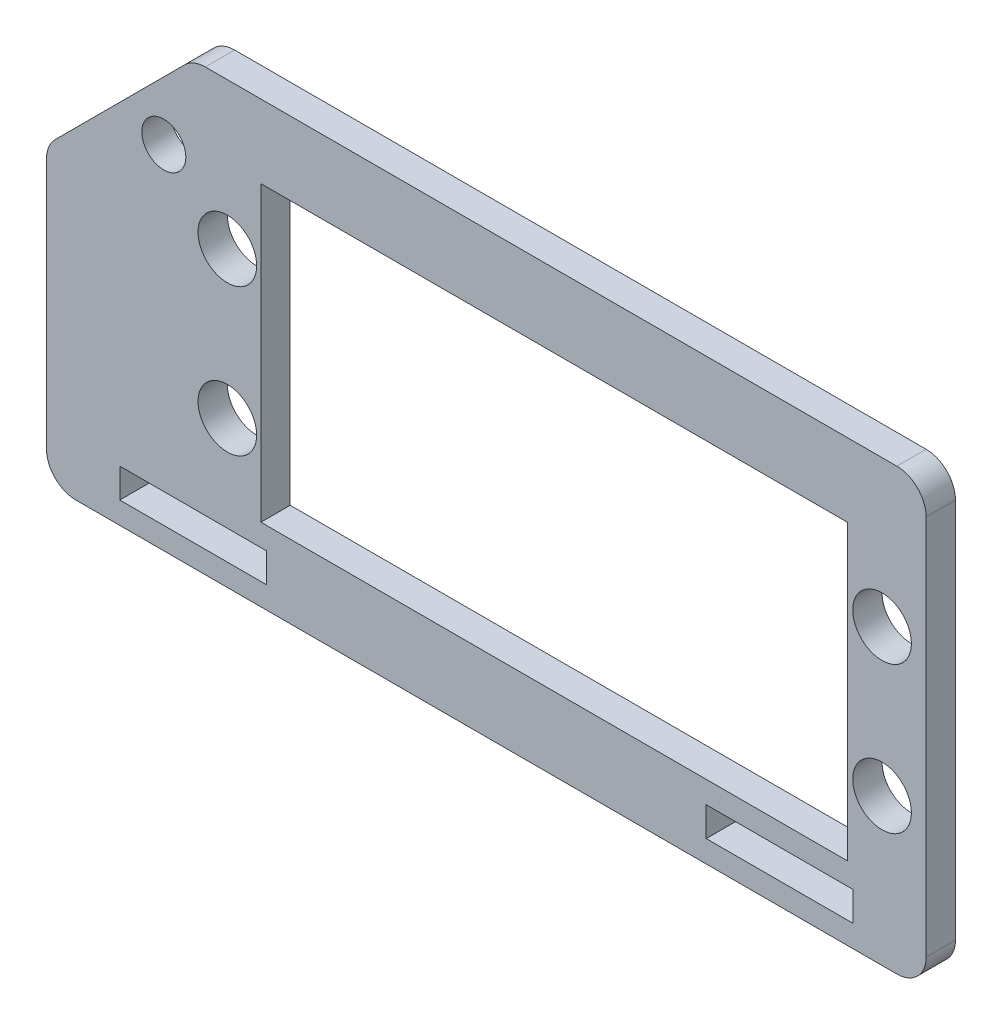
ISO-10303-21;
HEADER;
FILE_DESCRIPTION(('STEP AP214'),'2;1');
FILE_NAME('part.step','',(''),(''),'','','');
FILE_SCHEMA(('AUTOMOTIVE_DESIGN { 1 0 10303 214 1 1 1 1 }'));
ENDSEC;
DATA;
#1=APPLICATION_CONTEXT('core data for automotive mechanical design processes');
#2=APPLICATION_PROTOCOL_DEFINITION('international standard','automotive_design',2000,#1);
#3=PRODUCT_CONTEXT('',#1,'mechanical');
#4=PRODUCT('Part','Part','',(#3));
#5=PRODUCT_RELATED_PRODUCT_CATEGORY('part','',(#4));
#6=PRODUCT_DEFINITION_FORMATION('','',#4);
#7=PRODUCT_DEFINITION_CONTEXT('part definition',#1,'design');
#8=PRODUCT_DEFINITION('design','',#6,#7);
#9=PRODUCT_DEFINITION_SHAPE('','',#8);
#10=(LENGTH_UNIT() NAMED_UNIT(*) SI_UNIT(.MILLI.,.METRE.));
#11=(NAMED_UNIT(*) PLANE_ANGLE_UNIT() SI_UNIT($,.RADIAN.));
#12=(NAMED_UNIT(*) SI_UNIT($,.STERADIAN.) SOLID_ANGLE_UNIT());
#13=UNCERTAINTY_MEASURE_WITH_UNIT(LENGTH_MEASURE(1.E-05),#10,'distance_accuracy_value','');
#14=(GEOMETRIC_REPRESENTATION_CONTEXT(3) GLOBAL_UNCERTAINTY_ASSIGNED_CONTEXT((#13)) GLOBAL_UNIT_ASSIGNED_CONTEXT((#10,
#11,#12)) REPRESENTATION_CONTEXT('',''));
#15=CARTESIAN_POINT('',(0.,0.,0.));
#16=DIRECTION('',(0.,0.,1.));
#17=DIRECTION('',(1.,0.,0.));
#18=AXIS2_PLACEMENT_3D('',#15,#16,#17);
#19=CARTESIAN_POINT('',(2.251619932187,-0.110961656666,2.));
#20=DIRECTION('',(0.,0.,1.));
#21=DIRECTION('',(1.,0.,0.));
#22=AXIS2_PLACEMENT_3D('',#19,#20,#21);
#23=PLANE('',#22);
#24=CARTESIAN_POINT('',(-22.,9.,2.));
#25=DIRECTION('',(0.,0.,1.));
#26=DIRECTION('',(1.,0.,0.));
#27=AXIS2_PLACEMENT_3D('',#24,#25,#26);
#28=CIRCLE('',#27,1.5);
#29=CARTESIAN_POINT('',(-20.5,9.,2.));
#30=VERTEX_POINT('',#29);
#31=EDGE_CURVE('E386',#30,#30,#28,.T.);
#32=ORIENTED_EDGE('',*,*,#31,.F.);
#33=EDGE_LOOP('',(#32));
#34=FACE_BOUND('',#33,.T.);
#35=CARTESIAN_POINT('',(26.993404,5.015138,2.));
#36=DIRECTION('',(0.,0.,1.));
#37=DIRECTION('',(1.,0.,0.));
#38=AXIS2_PLACEMENT_3D('',#35,#36,#37);
#39=CIRCLE('',#38,2.);
#40=CARTESIAN_POINT('',(28.993404,5.015138,2.));
#41=VERTEX_POINT('',#40);
#42=EDGE_CURVE('E346',#41,#41,#39,.T.);
#43=ORIENTED_EDGE('',*,*,#42,.F.);
#44=EDGE_LOOP('',(#43));
#45=FACE_BOUND('',#44,.T.);
#46=CARTESIAN_POINT('',(26.993404,-4.984862,2.));
#47=DIRECTION('',(0.,0.,1.));
#48=DIRECTION('',(1.,0.,0.));
#49=AXIS2_PLACEMENT_3D('',#46,#47,#48);
#50=CIRCLE('',#49,2.);
#51=CARTESIAN_POINT('',(28.993404,-4.984862,2.));
#52=VERTEX_POINT('',#51);
#53=EDGE_CURVE('E343',#52,#52,#50,.T.);
#54=ORIENTED_EDGE('',*,*,#53,.F.);
#55=EDGE_LOOP('',(#54));
#56=FACE_BOUND('',#55,.T.);
#57=CARTESIAN_POINT('',(-17.667086,5.,2.));
#58=DIRECTION('',(0.,0.,1.));
#59=DIRECTION('',(1.,0.,0.));
#60=AXIS2_PLACEMENT_3D('',#57,#58,#59);
#61=CIRCLE('',#60,2.);
#62=CARTESIAN_POINT('',(-15.667086,5.,2.));
#63=VERTEX_POINT('',#62);
#64=EDGE_CURVE('E347',#63,#63,#61,.T.);
#65=ORIENTED_EDGE('',*,*,#64,.F.);
#66=EDGE_LOOP('',(#65));
#67=FACE_BOUND('',#66,.T.);
#68=CARTESIAN_POINT('',(-17.667086,-5.,2.));
#69=DIRECTION('',(0.,0.,1.));
#70=DIRECTION('',(1.,0.,0.));
#71=AXIS2_PLACEMENT_3D('',#68,#69,#70);
#72=CIRCLE('',#71,2.);
#73=CARTESIAN_POINT('',(-15.667086,-5.,2.));
#74=VERTEX_POINT('',#73);
#75=EDGE_CURVE('E351',#74,#74,#72,.T.);
#76=ORIENTED_EDGE('',*,*,#75,.F.);
#77=EDGE_LOOP('',(#76));
#78=FACE_BOUND('',#77,.T.);
#79=DIRECTION('',(-1.,0.,0.));
#80=VECTOR('',#79,1.);
#81=CARTESIAN_POINT('',(24.621888,10.,2.));
#82=LINE('',#81,#80);
#83=CARTESIAN_POINT('',(24.621888,10.,2.));
#84=VERTEX_POINT('',#83);
#85=CARTESIAN_POINT('',(-15.378112,10.,2.));
#86=VERTEX_POINT('',#85);
#87=EDGE_CURVE('E310',#84,#86,#82,.T.);
#88=ORIENTED_EDGE('',*,*,#87,.F.);
#89=DIRECTION('',(0.,1.,0.));
#90=VECTOR('',#89,1.);
#91=CARTESIAN_POINT('',(24.621888,-10.,2.));
#92=LINE('',#91,#90);
#93=CARTESIAN_POINT('',(24.621888,-10.,2.));
#94=VERTEX_POINT('',#93);
#95=EDGE_CURVE('E306',#94,#84,#92,.T.);
#96=ORIENTED_EDGE('',*,*,#95,.F.);
#97=DIRECTION('',(1.,0.,0.));
#98=VECTOR('',#97,1.);
#99=CARTESIAN_POINT('',(-15.378112,-10.,2.));
#100=LINE('',#99,#98);
#101=CARTESIAN_POINT('',(-15.378112,-10.,2.));
#102=VERTEX_POINT('',#101);
#103=EDGE_CURVE('E309',#102,#94,#100,.T.);
#104=ORIENTED_EDGE('',*,*,#103,.F.);
#105=DIRECTION('',(0.,-1.,0.));
#106=VECTOR('',#105,1.);
#107=CARTESIAN_POINT('',(-15.378112,10.,2.));
#108=LINE('',#107,#106);
#109=EDGE_CURVE('E333',#86,#102,#108,.T.);
#110=ORIENTED_EDGE('',*,*,#109,.F.);
#111=EDGE_LOOP('',(#88,#96,#104,#110));
#112=FACE_BOUND('',#111,.T.);
#113=DIRECTION('',(1.,0.,0.));
#114=VECTOR('',#113,1.);
#115=CARTESIAN_POINT('',(-20.,15.,2.));
#116=LINE('',#115,#114);
#117=CARTESIAN_POINT('',(-19.17157287525,15.,2.));
#118=VERTEX_POINT('',#117);
#119=CARTESIAN_POINT('',(28.,15.,2.));
#120=VERTEX_POINT('',#119);
#121=EDGE_CURVE('E297',#118,#120,#116,.T.);
#122=ORIENTED_EDGE('',*,*,#121,.F.);
#123=CARTESIAN_POINT('',(-19.17157287525,13.,2.));
#124=DIRECTION('',(0.,0.,1.));
#125=DIRECTION('',(0.,-1.,0.));
#126=AXIS2_PLACEMENT_3D('',#123,#124,#125);
#127=CIRCLE('',#126,2.);
#128=CARTESIAN_POINT('',(-20.58578643762,14.414213562373,2.));
#129=VERTEX_POINT('',#128);
#130=EDGE_CURVE('E408',#118,#129,#127,.T.);
#131=ORIENTED_EDGE('',*,*,#130,.T.);
#132=DIRECTION('',(-0.707106781186548,-0.707106781186548,0.));
#133=VECTOR('',#132,1.);
#134=CARTESIAN_POINT('',(-20.,15.,2.));
#135=LINE('',#134,#133);
#136=CARTESIAN_POINT('',(-29.41421356237,5.585786437627,2.));
#137=VERTEX_POINT('',#136);
#138=EDGE_CURVE('E354',#129,#137,#135,.T.);
#139=ORIENTED_EDGE('',*,*,#138,.T.);
#140=CARTESIAN_POINT('',(-28.,4.171572875254,2.));
#141=DIRECTION('',(0.,0.,-1.));
#142=DIRECTION('',(0.,-1.,0.));
#143=AXIS2_PLACEMENT_3D('',#140,#141,#142);
#144=CIRCLE('',#143,2.);
#145=CARTESIAN_POINT('',(-30.,4.171572875254,2.));
#146=VERTEX_POINT('',#145);
#147=EDGE_CURVE('E357',#146,#137,#144,.T.);
#148=ORIENTED_EDGE('',*,*,#147,.F.);
#149=DIRECTION('',(0.,-1.,0.));
#150=VECTOR('',#149,1.);
#151=CARTESIAN_POINT('',(-30.,5.,2.));
#152=LINE('',#151,#150);
#153=CARTESIAN_POINT('',(-30.,-13.,2.));
#154=VERTEX_POINT('',#153);
#155=EDGE_CURVE('E394',#146,#154,#152,.T.);
#156=ORIENTED_EDGE('',*,*,#155,.T.);
#157=CARTESIAN_POINT('',(-28.,-13.,2.));
#158=DIRECTION('',(0.,0.,-1.));
#159=DIRECTION('',(0.,-1.,0.));
#160=AXIS2_PLACEMENT_3D('',#157,#158,#159);
#161=CIRCLE('',#160,2.);
#162=CARTESIAN_POINT('',(-28.,-15.,2.));
#163=VERTEX_POINT('',#162);
#164=EDGE_CURVE('E390',#163,#154,#161,.T.);
#165=ORIENTED_EDGE('',*,*,#164,.F.);
#166=DIRECTION('',(1.,0.,0.));
#167=VECTOR('',#166,1.);
#168=CARTESIAN_POINT('',(-30.,-15.,2.));
#169=LINE('',#168,#167);
#170=CARTESIAN_POINT('',(28.,-15.,2.));
#171=VERTEX_POINT('',#170);
#172=EDGE_CURVE('E387',#163,#171,#169,.T.);
#173=ORIENTED_EDGE('',*,*,#172,.T.);
#174=CARTESIAN_POINT('',(28.,-13.,2.));
#175=DIRECTION('',(0.,0.,-1.));
#176=DIRECTION('',(0.,-1.,0.));
#177=AXIS2_PLACEMENT_3D('',#174,#175,#176);
#178=CIRCLE('',#177,2.);
#179=CARTESIAN_POINT('',(30.,-13.,2.));
#180=VERTEX_POINT('',#179);
#181=EDGE_CURVE('E323',#180,#171,#178,.T.);
#182=ORIENTED_EDGE('',*,*,#181,.F.);
#183=DIRECTION('',(0.,-1.,0.));
#184=VECTOR('',#183,1.);
#185=CARTESIAN_POINT('',(30.,15.,2.));
#186=LINE('',#185,#184);
#187=CARTESIAN_POINT('',(30.,13.,2.));
#188=VERTEX_POINT('',#187);
#189=EDGE_CURVE('E320',#188,#180,#186,.T.);
#190=ORIENTED_EDGE('',*,*,#189,.F.);
#191=CARTESIAN_POINT('',(28.,13.,2.));
#192=DIRECTION('',(0.,0.,-1.));
#193=DIRECTION('',(0.,-1.,0.));
#194=AXIS2_PLACEMENT_3D('',#191,#192,#193);
#195=CIRCLE('',#194,2.);
#196=EDGE_CURVE('E369',#120,#188,#195,.T.);
#197=ORIENTED_EDGE('',*,*,#196,.F.);
#198=EDGE_LOOP('',(#122,#131,#139,#148,#156,#165,#173,#182,#190,#197));
#199=FACE_BOUND('',#198,.T.);
#200=DIRECTION('',(1.,0.,0.));
#201=VECTOR('',#200,1.);
#202=CARTESIAN_POINT('',(2.251619932187,-11.5,2.));
#203=LINE('',#202,#201);
#204=CARTESIAN_POINT('',(15.,-11.5,2.));
#205=VERTEX_POINT('',#204);
#206=CARTESIAN_POINT('',(25.,-11.5,2.));
#207=VERTEX_POINT('',#206);
#208=EDGE_CURVE('E255',#205,#207,#203,.T.);
#209=ORIENTED_EDGE('',*,*,#208,.T.);
#210=DIRECTION('',(0.,-1.,0.));
#211=VECTOR('',#210,1.);
#212=CARTESIAN_POINT('',(25.,-0.110961656666,2.));
#213=LINE('',#212,#211);
#214=CARTESIAN_POINT('',(25.,-13.5,2.));
#215=VERTEX_POINT('',#214);
#216=EDGE_CURVE('E282',#207,#215,#213,.T.);
#217=ORIENTED_EDGE('',*,*,#216,.T.);
#218=DIRECTION('',(1.,0.,0.));
#219=VECTOR('',#218,1.);
#220=CARTESIAN_POINT('',(2.251619932187,-13.5,2.));
#221=LINE('',#220,#219);
#222=CARTESIAN_POINT('',(15.,-13.5,2.));
#223=VERTEX_POINT('',#222);
#224=EDGE_CURVE('E280',#223,#215,#221,.T.);
#225=ORIENTED_EDGE('',*,*,#224,.F.);
#226=DIRECTION('',(0.,-1.,0.));
#227=VECTOR('',#226,1.);
#228=CARTESIAN_POINT('',(15.,-0.110961656666,2.));
#229=LINE('',#228,#227);
#230=EDGE_CURVE('E278',#205,#223,#229,.T.);
#231=ORIENTED_EDGE('',*,*,#230,.F.);
#232=EDGE_LOOP('',(#209,#217,#225,#231));
#233=FACE_BOUND('',#232,.T.);
#234=DIRECTION('',(1.,0.,0.));
#235=VECTOR('',#234,1.);
#236=CARTESIAN_POINT('',(2.251619932187,-11.5,2.));
#237=LINE('',#236,#235);
#238=CARTESIAN_POINT('',(-25.,-11.5,2.));
#239=VERTEX_POINT('',#238);
#240=CARTESIAN_POINT('',(-15.,-11.5,2.));
#241=VERTEX_POINT('',#240);
#242=EDGE_CURVE('E285',#239,#241,#237,.T.);
#243=ORIENTED_EDGE('',*,*,#242,.T.);
#244=DIRECTION('',(0.,-1.,0.));
#245=VECTOR('',#244,1.);
#246=CARTESIAN_POINT('',(-15.,-0.110961656666,2.));
#247=LINE('',#246,#245);
#248=CARTESIAN_POINT('',(-15.,-13.5,2.));
#249=VERTEX_POINT('',#248);
#250=EDGE_CURVE('E238',#241,#249,#247,.T.);
#251=ORIENTED_EDGE('',*,*,#250,.T.);
#252=DIRECTION('',(1.,0.,0.));
#253=VECTOR('',#252,1.);
#254=CARTESIAN_POINT('',(2.251619932187,-13.5,2.));
#255=LINE('',#254,#253);
#256=CARTESIAN_POINT('',(-25.,-13.5,2.));
#257=VERTEX_POINT('',#256);
#258=EDGE_CURVE('E289',#257,#249,#255,.T.);
#259=ORIENTED_EDGE('',*,*,#258,.F.);
#260=DIRECTION('',(0.,-1.,0.));
#261=VECTOR('',#260,1.);
#262=CARTESIAN_POINT('',(-25.,-0.110961656666,2.));
#263=LINE('',#262,#261);
#264=EDGE_CURVE('E287',#239,#257,#263,.T.);
#265=ORIENTED_EDGE('',*,*,#264,.F.);
#266=EDGE_LOOP('',(#243,#251,#259,#265));
#267=FACE_BOUND('',#266,.T.);
#268=ADVANCED_FACE('F44',(#34,#45,#56,#67,#78,#112,#199,#233,#267),#23,.T.);
#269=CARTESIAN_POINT('',(2.251619932187,-0.110961656666,0.));
#270=DIRECTION('',(0.,0.,1.));
#271=DIRECTION('',(1.,0.,0.));
#272=AXIS2_PLACEMENT_3D('',#269,#270,#271);
#273=PLANE('',#272);
#274=DIRECTION('',(0.,-1.,0.));
#275=VECTOR('',#274,1.);
#276=CARTESIAN_POINT('',(25.,0.,0.));
#277=LINE('',#276,#275);
#278=CARTESIAN_POINT('',(25.,-11.5,0.));
#279=VERTEX_POINT('',#278);
#280=CARTESIAN_POINT('',(25.,-13.5,0.));
#281=VERTEX_POINT('',#280);
#282=EDGE_CURVE('E260',#279,#281,#277,.T.);
#283=ORIENTED_EDGE('',*,*,#282,.F.);
#284=DIRECTION('',(1.,0.,0.));
#285=VECTOR('',#284,1.);
#286=CARTESIAN_POINT('',(0.,-11.5,0.));
#287=LINE('',#286,#285);
#288=CARTESIAN_POINT('',(15.,-11.5,0.));
#289=VERTEX_POINT('',#288);
#290=EDGE_CURVE('E262',#289,#279,#287,.T.);
#291=ORIENTED_EDGE('',*,*,#290,.F.);
#292=DIRECTION('',(0.,-1.,0.));
#293=VECTOR('',#292,1.);
#294=CARTESIAN_POINT('',(15.,0.,0.));
#295=LINE('',#294,#293);
#296=CARTESIAN_POINT('',(15.,-13.5,0.));
#297=VERTEX_POINT('',#296);
#298=EDGE_CURVE('E264',#289,#297,#295,.T.);
#299=ORIENTED_EDGE('',*,*,#298,.T.);
#300=DIRECTION('',(1.,0.,0.));
#301=VECTOR('',#300,1.);
#302=CARTESIAN_POINT('',(0.,-13.5,0.));
#303=LINE('',#302,#301);
#304=EDGE_CURVE('E267',#297,#281,#303,.T.);
#305=ORIENTED_EDGE('',*,*,#304,.T.);
#306=EDGE_LOOP('',(#283,#291,#299,#305));
#307=FACE_BOUND('',#306,.T.);
#308=CARTESIAN_POINT('',(-22.,9.,0.));
#309=DIRECTION('',(0.,0.,1.));
#310=DIRECTION('',(1.,0.,0.));
#311=AXIS2_PLACEMENT_3D('',#308,#309,#310);
#312=CIRCLE('',#311,1.5);
#313=CARTESIAN_POINT('',(-20.5,9.,0.));
#314=VERTEX_POINT('',#313);
#315=EDGE_CURVE('E402',#314,#314,#312,.T.);
#316=ORIENTED_EDGE('',*,*,#315,.T.);
#317=EDGE_LOOP('',(#316));
#318=FACE_BOUND('',#317,.T.);
#319=CARTESIAN_POINT('',(26.993404,5.015138,0.));
#320=DIRECTION('',(0.,0.,1.));
#321=DIRECTION('',(1.,0.,0.));
#322=AXIS2_PLACEMENT_3D('',#319,#320,#321);
#323=CIRCLE('',#322,2.);
#324=CARTESIAN_POINT('',(28.993404,5.015138,0.));
#325=VERTEX_POINT('',#324);
#326=EDGE_CURVE('E376',#325,#325,#323,.T.);
#327=ORIENTED_EDGE('',*,*,#326,.T.);
#328=EDGE_LOOP('',(#327));
#329=FACE_BOUND('',#328,.T.);
#330=CARTESIAN_POINT('',(26.993404,-4.984862,0.));
#331=DIRECTION('',(0.,0.,1.));
#332=DIRECTION('',(1.,0.,0.));
#333=AXIS2_PLACEMENT_3D('',#330,#331,#332);
#334=CIRCLE('',#333,2.);
#335=CARTESIAN_POINT('',(28.993404,-4.984862,0.));
#336=VERTEX_POINT('',#335);
#337=EDGE_CURVE('E373',#336,#336,#334,.T.);
#338=ORIENTED_EDGE('',*,*,#337,.T.);
#339=EDGE_LOOP('',(#338));
#340=FACE_BOUND('',#339,.T.);
#341=CARTESIAN_POINT('',(-17.667086,5.,0.));
#342=DIRECTION('',(0.,0.,1.));
#343=DIRECTION('',(1.,0.,0.));
#344=AXIS2_PLACEMENT_3D('',#341,#342,#343);
#345=CIRCLE('',#344,2.);
#346=CARTESIAN_POINT('',(-15.667086,5.,0.));
#347=VERTEX_POINT('',#346);
#348=EDGE_CURVE('E48',#347,#347,#345,.T.);
#349=ORIENTED_EDGE('',*,*,#348,.T.);
#350=EDGE_LOOP('',(#349));
#351=FACE_BOUND('',#350,.T.);
#352=CARTESIAN_POINT('',(-17.667086,-5.,0.));
#353=DIRECTION('',(0.,0.,1.));
#354=DIRECTION('',(1.,0.,0.));
#355=AXIS2_PLACEMENT_3D('',#352,#353,#354);
#356=CIRCLE('',#355,2.);
#357=CARTESIAN_POINT('',(-15.667086,-5.,0.));
#358=VERTEX_POINT('',#357);
#359=EDGE_CURVE('E314',#358,#358,#356,.T.);
#360=ORIENTED_EDGE('',*,*,#359,.T.);
#361=EDGE_LOOP('',(#360));
#362=FACE_BOUND('',#361,.T.);
#363=DIRECTION('',(0.,-1.,0.));
#364=VECTOR('',#363,1.);
#365=CARTESIAN_POINT('',(-15.378112,10.,0.));
#366=LINE('',#365,#364);
#367=CARTESIAN_POINT('',(-15.378112,10.,0.));
#368=VERTEX_POINT('',#367);
#369=CARTESIAN_POINT('',(-15.378112,-10.,0.));
#370=VERTEX_POINT('',#369);
#371=EDGE_CURVE('E337',#368,#370,#366,.T.);
#372=ORIENTED_EDGE('',*,*,#371,.T.);
#373=DIRECTION('',(1.,0.,0.));
#374=VECTOR('',#373,1.);
#375=CARTESIAN_POINT('',(-15.378112,-10.,0.));
#376=LINE('',#375,#374);
#377=CARTESIAN_POINT('',(24.621888,-10.,0.));
#378=VERTEX_POINT('',#377);
#379=EDGE_CURVE('E334',#370,#378,#376,.T.);
#380=ORIENTED_EDGE('',*,*,#379,.T.);
#381=DIRECTION('',(0.,1.,0.));
#382=VECTOR('',#381,1.);
#383=CARTESIAN_POINT('',(24.621888,-10.,0.));
#384=LINE('',#383,#382);
#385=CARTESIAN_POINT('',(24.621888,10.,0.));
#386=VERTEX_POINT('',#385);
#387=EDGE_CURVE('E315',#378,#386,#384,.T.);
#388=ORIENTED_EDGE('',*,*,#387,.T.);
#389=DIRECTION('',(-1.,0.,0.));
#390=VECTOR('',#389,1.);
#391=CARTESIAN_POINT('',(24.621888,10.,0.));
#392=LINE('',#391,#390);
#393=EDGE_CURVE('E311',#386,#368,#392,.T.);
#394=ORIENTED_EDGE('',*,*,#393,.T.);
#395=EDGE_LOOP('',(#372,#380,#388,#394));
#396=FACE_BOUND('',#395,.T.);
#397=CARTESIAN_POINT('',(28.,13.,0.));
#398=DIRECTION('',(0.,0.,-1.));
#399=DIRECTION('',(0.,-1.,0.));
#400=AXIS2_PLACEMENT_3D('',#397,#398,#399);
#401=CIRCLE('',#400,2.);
#402=CARTESIAN_POINT('',(28.,15.,0.));
#403=VERTEX_POINT('',#402);
#404=CARTESIAN_POINT('',(30.,13.,0.));
#405=VERTEX_POINT('',#404);
#406=EDGE_CURVE('E296',#403,#405,#401,.T.);
#407=ORIENTED_EDGE('',*,*,#406,.T.);
#408=DIRECTION('',(0.,-1.,0.));
#409=VECTOR('',#408,1.);
#410=CARTESIAN_POINT('',(30.,15.,0.));
#411=LINE('',#410,#409);
#412=CARTESIAN_POINT('',(30.,-13.,0.));
#413=VERTEX_POINT('',#412);
#414=EDGE_CURVE('E324',#405,#413,#411,.T.);
#415=ORIENTED_EDGE('',*,*,#414,.T.);
#416=CARTESIAN_POINT('',(28.,-13.,0.));
#417=DIRECTION('',(0.,0.,-1.));
#418=DIRECTION('',(0.,-1.,0.));
#419=AXIS2_PLACEMENT_3D('',#416,#417,#418);
#420=CIRCLE('',#419,2.);
#421=CARTESIAN_POINT('',(28.,-15.,0.));
#422=VERTEX_POINT('',#421);
#423=EDGE_CURVE('E327',#413,#422,#420,.T.);
#424=ORIENTED_EDGE('',*,*,#423,.T.);
#425=DIRECTION('',(1.,0.,0.));
#426=VECTOR('',#425,1.);
#427=CARTESIAN_POINT('',(-30.,-15.,0.));
#428=LINE('',#427,#426);
#429=CARTESIAN_POINT('',(-28.,-15.,0.));
#430=VERTEX_POINT('',#429);
#431=EDGE_CURVE('E362',#430,#422,#428,.T.);
#432=ORIENTED_EDGE('',*,*,#431,.F.);
#433=CARTESIAN_POINT('',(-28.,-13.,0.));
#434=DIRECTION('',(0.,0.,-1.));
#435=DIRECTION('',(0.,-1.,0.));
#436=AXIS2_PLACEMENT_3D('',#433,#434,#435);
#437=CIRCLE('',#436,2.);
#438=CARTESIAN_POINT('',(-30.,-13.,0.));
#439=VERTEX_POINT('',#438);
#440=EDGE_CURVE('E359',#430,#439,#437,.T.);
#441=ORIENTED_EDGE('',*,*,#440,.T.);
#442=DIRECTION('',(0.,-1.,0.));
#443=VECTOR('',#442,1.);
#444=CARTESIAN_POINT('',(-30.,5.,0.));
#445=LINE('',#444,#443);
#446=CARTESIAN_POINT('',(-30.,4.171572875254,0.));
#447=VERTEX_POINT('',#446);
#448=EDGE_CURVE('E350',#447,#439,#445,.T.);
#449=ORIENTED_EDGE('',*,*,#448,.F.);
#450=CARTESIAN_POINT('',(-28.,4.171572875254,0.));
#451=DIRECTION('',(0.,0.,-1.));
#452=DIRECTION('',(0.,-1.,0.));
#453=AXIS2_PLACEMENT_3D('',#450,#451,#452);
#454=CIRCLE('',#453,2.);
#455=CARTESIAN_POINT('',(-29.41421356237,5.585786437627,0.));
#456=VERTEX_POINT('',#455);
#457=EDGE_CURVE('E342',#447,#456,#454,.T.);
#458=ORIENTED_EDGE('',*,*,#457,.T.);
#459=DIRECTION('',(-0.707106781186548,-0.707106781186548,0.));
#460=VECTOR('',#459,1.);
#461=CARTESIAN_POINT('',(-20.,15.,0.));
#462=LINE('',#461,#460);
#463=CARTESIAN_POINT('',(-20.58578643762,14.414213562373,0.));
#464=VERTEX_POINT('',#463);
#465=EDGE_CURVE('E338',#464,#456,#462,.T.);
#466=ORIENTED_EDGE('',*,*,#465,.F.);
#467=CARTESIAN_POINT('',(-19.17157287525,13.,0.));
#468=DIRECTION('',(0.,0.,1.));
#469=DIRECTION('',(0.,-1.,0.));
#470=AXIS2_PLACEMENT_3D('',#467,#468,#469);
#471=CIRCLE('',#470,2.);
#472=CARTESIAN_POINT('',(-19.17157287525,15.,0.));
#473=VERTEX_POINT('',#472);
#474=EDGE_CURVE('E341',#473,#464,#471,.T.);
#475=ORIENTED_EDGE('',*,*,#474,.F.);
#476=DIRECTION('',(1.,0.,0.));
#477=VECTOR('',#476,1.);
#478=CARTESIAN_POINT('',(-20.,15.,0.));
#479=LINE('',#478,#477);
#480=EDGE_CURVE('E292',#473,#403,#479,.T.);
#481=ORIENTED_EDGE('',*,*,#480,.T.);
#482=EDGE_LOOP('',(#407,#415,#424,#432,#441,#449,#458,#466,#475,#481));
#483=FACE_BOUND('',#482,.T.);
#484=DIRECTION('',(0.,-1.,0.));
#485=VECTOR('',#484,1.);
#486=CARTESIAN_POINT('',(-15.,0.,0.));
#487=LINE('',#486,#485);
#488=CARTESIAN_POINT('',(-15.,-11.5,0.));
#489=VERTEX_POINT('',#488);
#490=CARTESIAN_POINT('',(-15.,-13.5,0.));
#491=VERTEX_POINT('',#490);
#492=EDGE_CURVE('E231',#489,#491,#487,.T.);
#493=ORIENTED_EDGE('',*,*,#492,.F.);
#494=DIRECTION('',(1.,0.,0.));
#495=VECTOR('',#494,1.);
#496=CARTESIAN_POINT('',(0.,-11.5,0.));
#497=LINE('',#496,#495);
#498=CARTESIAN_POINT('',(-25.,-11.5,0.));
#499=VERTEX_POINT('',#498);
#500=EDGE_CURVE('E223',#499,#489,#497,.T.);
#501=ORIENTED_EDGE('',*,*,#500,.F.);
#502=DIRECTION('',(0.,-1.,0.));
#503=VECTOR('',#502,1.);
#504=CARTESIAN_POINT('',(-25.,0.,0.));
#505=LINE('',#504,#503);
#506=CARTESIAN_POINT('',(-25.,-13.5,0.));
#507=VERTEX_POINT('',#506);
#508=EDGE_CURVE('E230',#499,#507,#505,.T.);
#509=ORIENTED_EDGE('',*,*,#508,.T.);
#510=DIRECTION('',(1.,0.,0.));
#511=VECTOR('',#510,1.);
#512=CARTESIAN_POINT('',(0.,-13.5,0.));
#513=LINE('',#512,#511);
#514=EDGE_CURVE('E240',#507,#491,#513,.T.);
#515=ORIENTED_EDGE('',*,*,#514,.T.);
#516=EDGE_LOOP('',(#493,#501,#509,#515));
#517=FACE_BOUND('',#516,.T.);
#518=ADVANCED_FACE('F243',(#307,#318,#329,#340,#351,#362,#396,#483,#517),#273,.F.);
#519=CARTESIAN_POINT('',(-22.,9.,0.));
#520=DIRECTION('',(0.,0.,-1.));
#521=DIRECTION('',(1.,0.,0.));
#522=AXIS2_PLACEMENT_3D('',#519,#520,#521);
#523=CYLINDRICAL_SURFACE('',#522,1.5);
#524=DIRECTION('',(0.,0.,1.));
#525=VECTOR('',#524,1.);
#526=CARTESIAN_POINT('',(-20.5,9.,0.));
#527=LINE('',#526,#525);
#528=EDGE_CURVE('E11',#314,#30,#527,.T.);
#529=ORIENTED_EDGE('',*,*,#528,.T.);
#530=ORIENTED_EDGE('',*,*,#31,.T.);
#531=ORIENTED_EDGE('',*,*,#528,.F.);
#532=ORIENTED_EDGE('',*,*,#315,.F.);
#533=EDGE_LOOP('',(#529,#530,#531,#532));
#534=FACE_BOUND('',#533,.T.);
#535=ADVANCED_FACE('F496',(#534),#523,.F.);
#536=CARTESIAN_POINT('',(26.993404,5.015138,0.));
#537=DIRECTION('',(0.,0.,-1.));
#538=DIRECTION('',(1.,0.,0.));
#539=AXIS2_PLACEMENT_3D('',#536,#537,#538);
#540=CYLINDRICAL_SURFACE('',#539,2.);
#541=DIRECTION('',(0.,0.,1.));
#542=VECTOR('',#541,1.);
#543=CARTESIAN_POINT('',(28.993404,5.015138,0.));
#544=LINE('',#543,#542);
#545=EDGE_CURVE('E53',#325,#41,#544,.T.);
#546=ORIENTED_EDGE('',*,*,#545,.T.);
#547=ORIENTED_EDGE('',*,*,#42,.T.);
#548=ORIENTED_EDGE('',*,*,#545,.F.);
#549=ORIENTED_EDGE('',*,*,#326,.F.);
#550=EDGE_LOOP('',(#546,#547,#548,#549));
#551=FACE_BOUND('',#550,.T.);
#552=ADVANCED_FACE('F46',(#551),#540,.F.);
#553=CARTESIAN_POINT('',(26.993404,-4.984862,0.));
#554=DIRECTION('',(0.,0.,-1.));
#555=DIRECTION('',(1.,0.,0.));
#556=AXIS2_PLACEMENT_3D('',#553,#554,#555);
#557=CYLINDRICAL_SURFACE('',#556,2.);
#558=DIRECTION('',(0.,0.,1.));
#559=VECTOR('',#558,1.);
#560=CARTESIAN_POINT('',(28.993404,-4.984862,0.));
#561=LINE('',#560,#559);
#562=EDGE_CURVE('E319',#336,#52,#561,.T.);
#563=ORIENTED_EDGE('',*,*,#562,.T.);
#564=ORIENTED_EDGE('',*,*,#53,.T.);
#565=ORIENTED_EDGE('',*,*,#562,.F.);
#566=ORIENTED_EDGE('',*,*,#337,.F.);
#567=EDGE_LOOP('',(#563,#564,#565,#566));
#568=FACE_BOUND('',#567,.T.);
#569=ADVANCED_FACE('F534',(#568),#557,.F.);
#570=CARTESIAN_POINT('',(-17.667086,5.,0.));
#571=DIRECTION('',(0.,0.,-1.));
#572=DIRECTION('',(1.,0.,0.));
#573=AXIS2_PLACEMENT_3D('',#570,#571,#572);
#574=CYLINDRICAL_SURFACE('',#573,2.);
#575=DIRECTION('',(0.,0.,1.));
#576=VECTOR('',#575,1.);
#577=CARTESIAN_POINT('',(-15.667086,5.,0.));
#578=LINE('',#577,#576);
#579=EDGE_CURVE('E383',#347,#63,#578,.T.);
#580=ORIENTED_EDGE('',*,*,#579,.T.);
#581=ORIENTED_EDGE('',*,*,#64,.T.);
#582=ORIENTED_EDGE('',*,*,#579,.F.);
#583=ORIENTED_EDGE('',*,*,#348,.F.);
#584=EDGE_LOOP('',(#580,#581,#582,#583));
#585=FACE_BOUND('',#584,.T.);
#586=ADVANCED_FACE('F532',(#585),#574,.F.);
#587=CARTESIAN_POINT('',(-17.667086,-5.,0.));
#588=DIRECTION('',(0.,0.,-1.));
#589=DIRECTION('',(1.,0.,0.));
#590=AXIS2_PLACEMENT_3D('',#587,#588,#589);
#591=CYLINDRICAL_SURFACE('',#590,2.);
#592=DIRECTION('',(0.,0.,1.));
#593=VECTOR('',#592,1.);
#594=CARTESIAN_POINT('',(-15.667086,-5.,0.));
#595=LINE('',#594,#593);
#596=EDGE_CURVE('E304',#358,#74,#595,.T.);
#597=ORIENTED_EDGE('',*,*,#596,.T.);
#598=ORIENTED_EDGE('',*,*,#75,.T.);
#599=ORIENTED_EDGE('',*,*,#596,.F.);
#600=ORIENTED_EDGE('',*,*,#359,.F.);
#601=EDGE_LOOP('',(#597,#598,#599,#600));
#602=FACE_BOUND('',#601,.T.);
#603=ADVANCED_FACE('F503',(#602),#591,.F.);
#604=CARTESIAN_POINT('',(24.621888,10.,0.));
#605=DIRECTION('',(0.,-1.,0.));
#606=DIRECTION('',(0.,0.,-1.));
#607=AXIS2_PLACEMENT_3D('',#604,#605,#606);
#608=PLANE('',#607);
#609=DIRECTION('',(0.,0.,1.));
#610=VECTOR('',#609,1.);
#611=CARTESIAN_POINT('',(24.621888,10.,0.));
#612=LINE('',#611,#610);
#613=EDGE_CURVE('E302',#386,#84,#612,.T.);
#614=ORIENTED_EDGE('',*,*,#613,.T.);
#615=ORIENTED_EDGE('',*,*,#87,.T.);
#616=DIRECTION('',(0.,0.,1.));
#617=VECTOR('',#616,1.);
#618=CARTESIAN_POINT('',(-15.378112,10.,0.));
#619=LINE('',#618,#617);
#620=EDGE_CURVE('E300',#368,#86,#619,.T.);
#621=ORIENTED_EDGE('',*,*,#620,.F.);
#622=ORIENTED_EDGE('',*,*,#393,.F.);
#623=EDGE_LOOP('',(#614,#615,#621,#622));
#624=FACE_BOUND('',#623,.T.);
#625=ADVANCED_FACE('F516',(#624),#608,.T.);
#626=CARTESIAN_POINT('',(24.621888,-10.,0.));
#627=DIRECTION('',(-1.,0.,0.));
#628=DIRECTION('',(0.,0.,1.));
#629=AXIS2_PLACEMENT_3D('',#626,#627,#628);
#630=PLANE('',#629);
#631=DIRECTION('',(0.,0.,1.));
#632=VECTOR('',#631,1.);
#633=CARTESIAN_POINT('',(24.621888,-10.,0.));
#634=LINE('',#633,#632);
#635=EDGE_CURVE('E305',#378,#94,#634,.T.);
#636=ORIENTED_EDGE('',*,*,#635,.T.);
#637=ORIENTED_EDGE('',*,*,#95,.T.);
#638=ORIENTED_EDGE('',*,*,#613,.F.);
#639=ORIENTED_EDGE('',*,*,#387,.F.);
#640=EDGE_LOOP('',(#636,#637,#638,#639));
#641=FACE_BOUND('',#640,.T.);
#642=ADVANCED_FACE('F513',(#641),#630,.T.);
#643=CARTESIAN_POINT('',(-15.378112,-10.,0.));
#644=DIRECTION('',(0.,1.,0.));
#645=DIRECTION('',(1.,0.,0.));
#646=AXIS2_PLACEMENT_3D('',#643,#644,#645);
#647=PLANE('',#646);
#648=DIRECTION('',(0.,0.,1.));
#649=VECTOR('',#648,1.);
#650=CARTESIAN_POINT('',(-15.378112,-10.,0.));
#651=LINE('',#650,#649);
#652=EDGE_CURVE('E380',#370,#102,#651,.T.);
#653=ORIENTED_EDGE('',*,*,#652,.T.);
#654=ORIENTED_EDGE('',*,*,#103,.T.);
#655=ORIENTED_EDGE('',*,*,#635,.F.);
#656=ORIENTED_EDGE('',*,*,#379,.F.);
#657=EDGE_LOOP('',(#653,#654,#655,#656));
#658=FACE_BOUND('',#657,.T.);
#659=ADVANCED_FACE('F509',(#658),#647,.T.);
#660=CARTESIAN_POINT('',(-15.378112,10.,0.));
#661=DIRECTION('',(1.,0.,0.));
#662=DIRECTION('',(0.,1.,0.));
#663=AXIS2_PLACEMENT_3D('',#660,#661,#662);
#664=PLANE('',#663);
#665=ORIENTED_EDGE('',*,*,#620,.T.);
#666=ORIENTED_EDGE('',*,*,#109,.T.);
#667=ORIENTED_EDGE('',*,*,#652,.F.);
#668=ORIENTED_EDGE('',*,*,#371,.F.);
#669=EDGE_LOOP('',(#665,#666,#667,#668));
#670=FACE_BOUND('',#669,.T.);
#671=ADVANCED_FACE('F512',(#670),#664,.T.);
#672=CARTESIAN_POINT('',(-28.,-13.,0.));
#673=DIRECTION('',(0.,0.,1.));
#674=DIRECTION('',(0.,-1.,0.));
#675=AXIS2_PLACEMENT_3D('',#672,#673,#674);
#676=CYLINDRICAL_SURFACE('',#675,2.);
#677=DIRECTION('',(0.,0.,1.));
#678=VECTOR('',#677,1.);
#679=CARTESIAN_POINT('',(-28.,-15.,0.));
#680=LINE('',#679,#678);
#681=EDGE_CURVE('E298',#430,#163,#680,.T.);
#682=ORIENTED_EDGE('',*,*,#681,.T.);
#683=ORIENTED_EDGE('',*,*,#164,.T.);
#684=DIRECTION('',(0.,0.,1.));
#685=VECTOR('',#684,1.);
#686=CARTESIAN_POINT('',(-30.,-13.,0.));
#687=LINE('',#686,#685);
#688=EDGE_CURVE('E301',#439,#154,#687,.T.);
#689=ORIENTED_EDGE('',*,*,#688,.F.);
#690=ORIENTED_EDGE('',*,*,#440,.F.);
#691=EDGE_LOOP('',(#682,#683,#689,#690));
#692=FACE_BOUND('',#691,.T.);
#693=ADVANCED_FACE('F461',(#692),#676,.T.);
#694=CARTESIAN_POINT('',(-30.,-15.,0.));
#695=DIRECTION('',(0.,1.,0.));
#696=DIRECTION('',(1.,0.,0.));
#697=AXIS2_PLACEMENT_3D('',#694,#695,#696);
#698=PLANE('',#697);
#699=DIRECTION('',(0.,0.,1.));
#700=VECTOR('',#699,1.);
#701=CARTESIAN_POINT('',(28.,-15.,0.));
#702=LINE('',#701,#700);
#703=EDGE_CURVE('E328',#422,#171,#702,.T.);
#704=ORIENTED_EDGE('',*,*,#703,.T.);
#705=ORIENTED_EDGE('',*,*,#172,.F.);
#706=ORIENTED_EDGE('',*,*,#681,.F.);
#707=ORIENTED_EDGE('',*,*,#431,.T.);
#708=EDGE_LOOP('',(#704,#705,#706,#707));
#709=FACE_BOUND('',#708,.T.);
#710=ADVANCED_FACE('F463',(#709),#698,.F.);
#711=CARTESIAN_POINT('',(-30.,5.,0.));
#712=DIRECTION('',(1.,0.,0.));
#713=DIRECTION('',(0.,1.,0.));
#714=AXIS2_PLACEMENT_3D('',#711,#712,#713);
#715=PLANE('',#714);
#716=ORIENTED_EDGE('',*,*,#688,.T.);
#717=ORIENTED_EDGE('',*,*,#155,.F.);
#718=DIRECTION('',(0.,0.,1.));
#719=VECTOR('',#718,1.);
#720=CARTESIAN_POINT('',(-30.,4.171572875254,0.));
#721=LINE('',#720,#719);
#722=EDGE_CURVE('E330',#447,#146,#721,.T.);
#723=ORIENTED_EDGE('',*,*,#722,.F.);
#724=ORIENTED_EDGE('',*,*,#448,.T.);
#725=EDGE_LOOP('',(#716,#717,#723,#724));
#726=FACE_BOUND('',#725,.T.);
#727=ADVANCED_FACE('F456',(#726),#715,.F.);
#728=CARTESIAN_POINT('',(28.,-13.,0.));
#729=DIRECTION('',(0.,0.,1.));
#730=DIRECTION('',(1.,0.,0.));
#731=AXIS2_PLACEMENT_3D('',#728,#729,#730);
#732=CYLINDRICAL_SURFACE('',#731,2.);
#733=DIRECTION('',(0.,0.,1.));
#734=VECTOR('',#733,1.);
#735=CARTESIAN_POINT('',(30.,-13.,0.));
#736=LINE('',#735,#734);
#737=EDGE_CURVE('E413',#413,#180,#736,.T.);
#738=ORIENTED_EDGE('',*,*,#737,.T.);
#739=ORIENTED_EDGE('',*,*,#181,.T.);
#740=ORIENTED_EDGE('',*,*,#703,.F.);
#741=ORIENTED_EDGE('',*,*,#423,.F.);
#742=EDGE_LOOP('',(#738,#739,#740,#741));
#743=FACE_BOUND('',#742,.T.);
#744=ADVANCED_FACE('F466',(#743),#732,.T.);
#745=CARTESIAN_POINT('',(-28.,4.171572875254,0.));
#746=DIRECTION('',(0.,0.,1.));
#747=DIRECTION('',(-1.,0.,0.));
#748=AXIS2_PLACEMENT_3D('',#745,#746,#747);
#749=CYLINDRICAL_SURFACE('',#748,2.);
#750=ORIENTED_EDGE('',*,*,#722,.T.);
#751=ORIENTED_EDGE('',*,*,#147,.T.);
#752=DIRECTION('',(0.,0.,1.));
#753=VECTOR('',#752,1.);
#754=CARTESIAN_POINT('',(-29.41421356237,5.585786437627,0.));
#755=LINE('',#754,#753);
#756=EDGE_CURVE('E393',#456,#137,#755,.T.);
#757=ORIENTED_EDGE('',*,*,#756,.F.);
#758=ORIENTED_EDGE('',*,*,#457,.F.);
#759=EDGE_LOOP('',(#750,#751,#757,#758));
#760=FACE_BOUND('',#759,.T.);
#761=ADVANCED_FACE('F442',(#760),#749,.T.);
#762=CARTESIAN_POINT('',(30.,15.,0.));
#763=DIRECTION('',(1.,0.,0.));
#764=DIRECTION('',(0.,1.,0.));
#765=AXIS2_PLACEMENT_3D('',#762,#763,#764);
#766=PLANE('',#765);
#767=ORIENTED_EDGE('',*,*,#414,.F.);
#768=DIRECTION('',(0.,0.,1.));
#769=VECTOR('',#768,1.);
#770=CARTESIAN_POINT('',(30.,13.,0.));
#771=LINE('',#770,#769);
#772=EDGE_CURVE('E358',#405,#188,#771,.T.);
#773=ORIENTED_EDGE('',*,*,#772,.T.);
#774=ORIENTED_EDGE('',*,*,#189,.T.);
#775=ORIENTED_EDGE('',*,*,#737,.F.);
#776=EDGE_LOOP('',(#767,#773,#774,#775));
#777=FACE_BOUND('',#776,.T.);
#778=ADVANCED_FACE('F469',(#777),#766,.T.);
#779=CARTESIAN_POINT('',(-20.,15.,0.));
#780=DIRECTION('',(0.707106781186548,-0.707106781186548,0.));
#781=DIRECTION('',(0.,0.,-1.));
#782=AXIS2_PLACEMENT_3D('',#779,#780,#781);
#783=PLANE('',#782);
#784=ORIENTED_EDGE('',*,*,#756,.T.);
#785=ORIENTED_EDGE('',*,*,#138,.F.);
#786=DIRECTION('',(0.,0.,1.));
#787=VECTOR('',#786,1.);
#788=CARTESIAN_POINT('',(-20.58578643762,14.414213562373,0.));
#789=LINE('',#788,#787);
#790=EDGE_CURVE('E411',#464,#129,#789,.T.);
#791=ORIENTED_EDGE('',*,*,#790,.F.);
#792=ORIENTED_EDGE('',*,*,#465,.T.);
#793=EDGE_LOOP('',(#784,#785,#791,#792));
#794=FACE_BOUND('',#793,.T.);
#795=ADVANCED_FACE('F449',(#794),#783,.F.);
#796=CARTESIAN_POINT('',(28.,13.,0.));
#797=DIRECTION('',(0.,0.,1.));
#798=DIRECTION('',(0.,1.,0.));
#799=AXIS2_PLACEMENT_3D('',#796,#797,#798);
#800=CYLINDRICAL_SURFACE('',#799,2.);
#801=DIRECTION('',(0.,0.,1.));
#802=VECTOR('',#801,1.);
#803=CARTESIAN_POINT('',(28.,15.,0.));
#804=LINE('',#803,#802);
#805=EDGE_CURVE('E293',#403,#120,#804,.T.);
#806=ORIENTED_EDGE('',*,*,#805,.T.);
#807=ORIENTED_EDGE('',*,*,#196,.T.);
#808=ORIENTED_EDGE('',*,*,#772,.F.);
#809=ORIENTED_EDGE('',*,*,#406,.F.);
#810=EDGE_LOOP('',(#806,#807,#808,#809));
#811=FACE_BOUND('',#810,.T.);
#812=ADVANCED_FACE('F471',(#811),#800,.T.);
#813=CARTESIAN_POINT('',(-19.17157287525,13.,0.));
#814=DIRECTION('',(0.,0.,1.));
#815=DIRECTION('',(0.,1.,0.));
#816=AXIS2_PLACEMENT_3D('',#813,#814,#815);
#817=CYLINDRICAL_SURFACE('',#816,2.);
#818=ORIENTED_EDGE('',*,*,#474,.T.);
#819=ORIENTED_EDGE('',*,*,#790,.T.);
#820=ORIENTED_EDGE('',*,*,#130,.F.);
#821=DIRECTION('',(0.,0.,1.));
#822=VECTOR('',#821,1.);
#823=CARTESIAN_POINT('',(-19.17157287525,15.,0.));
#824=LINE('',#823,#822);
#825=EDGE_CURVE('E407',#473,#118,#824,.T.);
#826=ORIENTED_EDGE('',*,*,#825,.F.);
#827=EDGE_LOOP('',(#818,#819,#820,#826));
#828=FACE_BOUND('',#827,.T.);
#829=ADVANCED_FACE('F478',(#828),#817,.T.);
#830=CARTESIAN_POINT('',(-20.,15.,0.));
#831=DIRECTION('',(0.,1.,0.));
#832=DIRECTION('',(1.,0.,0.));
#833=AXIS2_PLACEMENT_3D('',#830,#831,#832);
#834=PLANE('',#833);
#835=ORIENTED_EDGE('',*,*,#480,.F.);
#836=ORIENTED_EDGE('',*,*,#825,.T.);
#837=ORIENTED_EDGE('',*,*,#121,.T.);
#838=ORIENTED_EDGE('',*,*,#805,.F.);
#839=EDGE_LOOP('',(#835,#836,#837,#838));
#840=FACE_BOUND('',#839,.T.);
#841=ADVANCED_FACE('F475',(#840),#834,.T.);
#842=CARTESIAN_POINT('',(25.,0.,0.));
#843=DIRECTION('',(-1.,0.,0.));
#844=DIRECTION('',(0.,0.,1.));
#845=AXIS2_PLACEMENT_3D('',#842,#843,#844);
#846=PLANE('',#845);
#847=DIRECTION('',(0.,0.,1.));
#848=VECTOR('',#847,1.);
#849=CARTESIAN_POINT('',(25.,-11.5,0.));
#850=LINE('',#849,#848);
#851=EDGE_CURVE('E69',#279,#207,#850,.T.);
#852=ORIENTED_EDGE('',*,*,#851,.F.);
#853=ORIENTED_EDGE('',*,*,#282,.T.);
#854=DIRECTION('',(0.,0.,1.));
#855=VECTOR('',#854,1.);
#856=CARTESIAN_POINT('',(25.,-13.5,0.));
#857=LINE('',#856,#855);
#858=EDGE_CURVE('E245',#281,#215,#857,.T.);
#859=ORIENTED_EDGE('',*,*,#858,.T.);
#860=ORIENTED_EDGE('',*,*,#216,.F.);
#861=EDGE_LOOP('',(#852,#853,#859,#860));
#862=FACE_BOUND('',#861,.T.);
#863=ADVANCED_FACE('F485',(#862),#846,.T.);
#864=CARTESIAN_POINT('',(0.,-13.5,0.));
#865=DIRECTION('',(0.,-1.,0.));
#866=DIRECTION('',(0.,0.,-1.));
#867=AXIS2_PLACEMENT_3D('',#864,#865,#866);
#868=PLANE('',#867);
#869=ORIENTED_EDGE('',*,*,#224,.T.);
#870=ORIENTED_EDGE('',*,*,#858,.F.);
#871=ORIENTED_EDGE('',*,*,#304,.F.);
#872=DIRECTION('',(0.,0.,1.));
#873=VECTOR('',#872,1.);
#874=CARTESIAN_POINT('',(15.,-13.5,0.));
#875=LINE('',#874,#873);
#876=EDGE_CURVE('E248',#297,#223,#875,.T.);
#877=ORIENTED_EDGE('',*,*,#876,.T.);
#878=EDGE_LOOP('',(#869,#870,#871,#877));
#879=FACE_BOUND('',#878,.T.);
#880=ADVANCED_FACE('F607',(#879),#868,.F.);
#881=CARTESIAN_POINT('',(15.,0.,0.));
#882=DIRECTION('',(-1.,0.,0.));
#883=DIRECTION('',(0.,0.,1.));
#884=AXIS2_PLACEMENT_3D('',#881,#882,#883);
#885=PLANE('',#884);
#886=ORIENTED_EDGE('',*,*,#230,.T.);
#887=ORIENTED_EDGE('',*,*,#876,.F.);
#888=ORIENTED_EDGE('',*,*,#298,.F.);
#889=DIRECTION('',(0.,0.,1.));
#890=VECTOR('',#889,1.);
#891=CARTESIAN_POINT('',(15.,-11.5,0.));
#892=LINE('',#891,#890);
#893=EDGE_CURVE('E272',#289,#205,#892,.T.);
#894=ORIENTED_EDGE('',*,*,#893,.T.);
#895=EDGE_LOOP('',(#886,#887,#888,#894));
#896=FACE_BOUND('',#895,.T.);
#897=ADVANCED_FACE('F618',(#896),#885,.F.);
#898=CARTESIAN_POINT('',(0.,-11.5,0.));
#899=DIRECTION('',(0.,-1.,0.));
#900=DIRECTION('',(0.,0.,-1.));
#901=AXIS2_PLACEMENT_3D('',#898,#899,#900);
#902=PLANE('',#901);
#903=ORIENTED_EDGE('',*,*,#893,.F.);
#904=ORIENTED_EDGE('',*,*,#290,.T.);
#905=ORIENTED_EDGE('',*,*,#851,.T.);
#906=ORIENTED_EDGE('',*,*,#208,.F.);
#907=EDGE_LOOP('',(#903,#904,#905,#906));
#908=FACE_BOUND('',#907,.T.);
#909=ADVANCED_FACE('F629',(#908),#902,.T.);
#910=CARTESIAN_POINT('',(-15.,0.,0.));
#911=DIRECTION('',(-1.,0.,0.));
#912=DIRECTION('',(0.,0.,1.));
#913=AXIS2_PLACEMENT_3D('',#910,#911,#912);
#914=PLANE('',#913);
#915=DIRECTION('',(0.,0.,1.));
#916=VECTOR('',#915,1.);
#917=CARTESIAN_POINT('',(-15.,-11.5,0.));
#918=LINE('',#917,#916);
#919=EDGE_CURVE('E61',#489,#241,#918,.T.);
#920=ORIENTED_EDGE('',*,*,#919,.F.);
#921=ORIENTED_EDGE('',*,*,#492,.T.);
#922=DIRECTION('',(0.,0.,1.));
#923=VECTOR('',#922,1.);
#924=CARTESIAN_POINT('',(-15.,-13.5,0.));
#925=LINE('',#924,#923);
#926=EDGE_CURVE('E253',#491,#249,#925,.T.);
#927=ORIENTED_EDGE('',*,*,#926,.T.);
#928=ORIENTED_EDGE('',*,*,#250,.F.);
#929=EDGE_LOOP('',(#920,#921,#927,#928));
#930=FACE_BOUND('',#929,.T.);
#931=ADVANCED_FACE('F234',(#930),#914,.T.);
#932=CARTESIAN_POINT('',(0.,-13.5,0.));
#933=DIRECTION('',(0.,-1.,0.));
#934=DIRECTION('',(0.,0.,-1.));
#935=AXIS2_PLACEMENT_3D('',#932,#933,#934);
#936=PLANE('',#935);
#937=ORIENTED_EDGE('',*,*,#258,.T.);
#938=ORIENTED_EDGE('',*,*,#926,.F.);
#939=ORIENTED_EDGE('',*,*,#514,.F.);
#940=DIRECTION('',(0.,0.,1.));
#941=VECTOR('',#940,1.);
#942=CARTESIAN_POINT('',(-25.,-13.5,0.));
#943=LINE('',#942,#941);
#944=EDGE_CURVE('E256',#507,#257,#943,.T.);
#945=ORIENTED_EDGE('',*,*,#944,.T.);
#946=EDGE_LOOP('',(#937,#938,#939,#945));
#947=FACE_BOUND('',#946,.T.);
#948=ADVANCED_FACE('F649',(#947),#936,.F.);
#949=CARTESIAN_POINT('',(-25.,0.,0.));
#950=DIRECTION('',(-1.,0.,0.));
#951=DIRECTION('',(0.,0.,1.));
#952=AXIS2_PLACEMENT_3D('',#949,#950,#951);
#953=PLANE('',#952);
#954=ORIENTED_EDGE('',*,*,#264,.T.);
#955=ORIENTED_EDGE('',*,*,#944,.F.);
#956=ORIENTED_EDGE('',*,*,#508,.F.);
#957=DIRECTION('',(0.,0.,1.));
#958=VECTOR('',#957,1.);
#959=CARTESIAN_POINT('',(-25.,-11.5,0.));
#960=LINE('',#959,#958);
#961=EDGE_CURVE('E226',#499,#239,#960,.T.);
#962=ORIENTED_EDGE('',*,*,#961,.T.);
#963=EDGE_LOOP('',(#954,#955,#956,#962));
#964=FACE_BOUND('',#963,.T.);
#965=ADVANCED_FACE('F659',(#964),#953,.F.);
#966=CARTESIAN_POINT('',(0.,-11.5,0.));
#967=DIRECTION('',(0.,-1.,0.));
#968=DIRECTION('',(0.,0.,-1.));
#969=AXIS2_PLACEMENT_3D('',#966,#967,#968);
#970=PLANE('',#969);
#971=ORIENTED_EDGE('',*,*,#961,.F.);
#972=ORIENTED_EDGE('',*,*,#500,.T.);
#973=ORIENTED_EDGE('',*,*,#919,.T.);
#974=ORIENTED_EDGE('',*,*,#242,.F.);
#975=EDGE_LOOP('',(#971,#972,#973,#974));
#976=FACE_BOUND('',#975,.T.);
#977=ADVANCED_FACE('F224',(#976),#970,.T.);
#978=CLOSED_SHELL('',(#268,#518,#535,#552,#569,#586,#603,#625,#642,#659,#671,#693,#710,#727,
#744,#761,#778,#795,#812,#829,#841,#863,#880,#897,#909,#931,#948,#965,#977));
#979=MANIFOLD_SOLID_BREP('B2',#978);
#980=ADVANCED_BREP_SHAPE_REPRESENTATION('',(#18,#979),#14);
#981=SHAPE_DEFINITION_REPRESENTATION(#9,#980);
ENDSEC;
END-ISO-10303-21;
